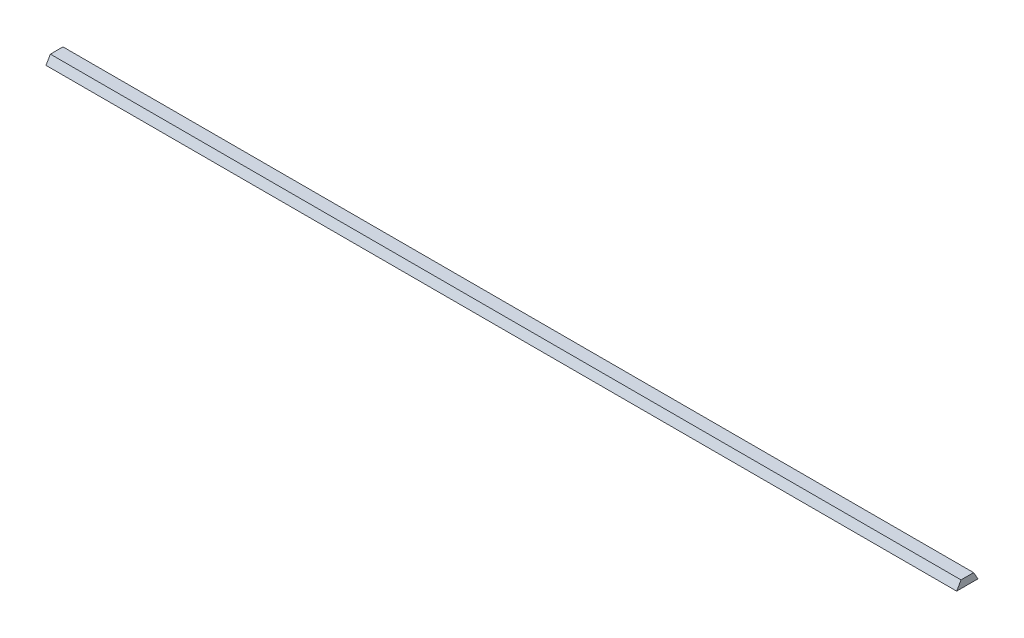
ISO-10303-21;
HEADER;
FILE_DESCRIPTION(('STEP AP214'),'2;1');
FILE_NAME('part.step','',(''),(''),'','','');
FILE_SCHEMA(('AUTOMOTIVE_DESIGN { 1 0 10303 214 1 1 1 1 }'));
ENDSEC;
DATA;
#1=APPLICATION_CONTEXT('core data for automotive mechanical design processes');
#2=APPLICATION_PROTOCOL_DEFINITION('international standard','automotive_design',2000,#1);
#3=PRODUCT_CONTEXT('',#1,'mechanical');
#4=PRODUCT('Part','Part','',(#3));
#5=PRODUCT_RELATED_PRODUCT_CATEGORY('part','',(#4));
#6=PRODUCT_DEFINITION_FORMATION('','',#4);
#7=PRODUCT_DEFINITION_CONTEXT('part definition',#1,'design');
#8=PRODUCT_DEFINITION('design','',#6,#7);
#9=PRODUCT_DEFINITION_SHAPE('','',#8);
#10=(LENGTH_UNIT() NAMED_UNIT(*) SI_UNIT(.MILLI.,.METRE.));
#11=(NAMED_UNIT(*) PLANE_ANGLE_UNIT() SI_UNIT($,.RADIAN.));
#12=(NAMED_UNIT(*) SI_UNIT($,.STERADIAN.) SOLID_ANGLE_UNIT());
#13=UNCERTAINTY_MEASURE_WITH_UNIT(LENGTH_MEASURE(1.E-05),#10,'distance_accuracy_value','');
#14=(GEOMETRIC_REPRESENTATION_CONTEXT(3) GLOBAL_UNCERTAINTY_ASSIGNED_CONTEXT((#13)) GLOBAL_UNIT_ASSIGNED_CONTEXT((#10,
#11,#12)) REPRESENTATION_CONTEXT('',''));
#15=CARTESIAN_POINT('',(0.,0.,0.));
#16=DIRECTION('',(0.,0.,1.));
#17=DIRECTION('',(1.,0.,0.));
#18=AXIS2_PLACEMENT_3D('',#15,#16,#17);
#19=CARTESIAN_POINT('',(2293.41358961173,0.,-26.8735226280625));
#20=DIRECTION('',(0.,-0.500000000000004,0.866025403784436));
#21=DIRECTION('',(0.,-0.866025403784436,-0.500000000000004));
#22=AXIS2_PLACEMENT_3D('',#19,#20,#21);
#23=PLANE('',#22);
#24=DIRECTION('',(0.,0.866025403784436,0.500000000000004));
#25=VECTOR('',#24,1.);
#26=CARTESIAN_POINT('',(0.,0.,-26.8735226280625));
#27=LINE('',#26,#25);
#28=CARTESIAN_POINT('',(0.,0.,-26.8735226280625));
#29=VERTEX_POINT('',#28);
#30=CARTESIAN_POINT('',(0.,19.05,-15.875));
#31=VERTEX_POINT('',#30);
#32=EDGE_CURVE('E98',#29,#31,#27,.T.);
#33=ORIENTED_EDGE('',*,*,#32,.T.);
#34=DIRECTION('',(-1.,0.,0.));
#35=VECTOR('',#34,1.);
#36=CARTESIAN_POINT('',(2293.41358961173,19.05,-15.875));
#37=LINE('',#36,#35);
#38=CARTESIAN_POINT('',(2293.41358961173,19.05,-15.875));
#39=VERTEX_POINT('',#38);
#40=EDGE_CURVE('E11',#39,#31,#37,.T.);
#41=ORIENTED_EDGE('',*,*,#40,.F.);
#42=DIRECTION('',(0.,0.866025403784436,0.500000000000004));
#43=VECTOR('',#42,1.);
#44=CARTESIAN_POINT('',(2293.41358961173,0.,-26.8735226280625));
#45=LINE('',#44,#43);
#46=CARTESIAN_POINT('',(2293.41358961173,0.,-26.8735226280625));
#47=VERTEX_POINT('',#46);
#48=EDGE_CURVE('E85',#47,#39,#45,.T.);
#49=ORIENTED_EDGE('',*,*,#48,.F.);
#50=DIRECTION('',(-1.,0.,0.));
#51=VECTOR('',#50,1.);
#52=CARTESIAN_POINT('',(2293.41358961173,0.,-26.8735226280625));
#53=LINE('',#52,#51);
#54=EDGE_CURVE('E94',#47,#29,#53,.T.);
#55=ORIENTED_EDGE('',*,*,#54,.T.);
#56=EDGE_LOOP('',(#33,#41,#49,#55));
#57=FACE_BOUND('',#56,.T.);
#58=ADVANCED_FACE('F34',(#57),#23,.F.);
#59=CARTESIAN_POINT('',(2293.41358961173,19.05,15.875));
#60=DIRECTION('',(0.,-1.,0.));
#61=DIRECTION('',(0.,0.,-1.));
#62=AXIS2_PLACEMENT_3D('',#59,#60,#61);
#63=PLANE('',#62);
#64=DIRECTION('',(0.,0.,1.));
#65=VECTOR('',#64,1.);
#66=CARTESIAN_POINT('',(0.,19.05,15.875));
#67=LINE('',#66,#65);
#68=CARTESIAN_POINT('',(0.,19.05,15.875));
#69=VERTEX_POINT('',#68);
#70=EDGE_CURVE('E89',#31,#69,#67,.T.);
#71=ORIENTED_EDGE('',*,*,#70,.T.);
#72=DIRECTION('',(-1.,0.,0.));
#73=VECTOR('',#72,1.);
#74=CARTESIAN_POINT('',(2293.41358961173,19.05,15.875));
#75=LINE('',#74,#73);
#76=CARTESIAN_POINT('',(2293.41358961173,19.05,15.875));
#77=VERTEX_POINT('',#76);
#78=EDGE_CURVE('E42',#77,#69,#75,.T.);
#79=ORIENTED_EDGE('',*,*,#78,.F.);
#80=DIRECTION('',(0.,0.,1.));
#81=VECTOR('',#80,1.);
#82=CARTESIAN_POINT('',(2293.41358961173,19.05,15.875));
#83=LINE('',#82,#81);
#84=EDGE_CURVE('E80',#39,#77,#83,.T.);
#85=ORIENTED_EDGE('',*,*,#84,.F.);
#86=ORIENTED_EDGE('',*,*,#40,.T.);
#87=EDGE_LOOP('',(#71,#79,#85,#86));
#88=FACE_BOUND('',#87,.T.);
#89=ADVANCED_FACE('F88',(#88),#63,.F.);
#90=CARTESIAN_POINT('',(2293.41358961173,0.,26.8735226280625));
#91=DIRECTION('',(0.,-0.500000000000004,-0.866025403784436));
#92=DIRECTION('',(0.,0.866025403784436,-0.500000000000004));
#93=AXIS2_PLACEMENT_3D('',#90,#91,#92);
#94=PLANE('',#93);
#95=DIRECTION('',(0.,-0.866025403784436,0.500000000000004));
#96=VECTOR('',#95,1.);
#97=CARTESIAN_POINT('',(0.,0.,26.8735226280625));
#98=LINE('',#97,#96);
#99=CARTESIAN_POINT('',(0.,0.,26.8735226280625));
#100=VERTEX_POINT('',#99);
#101=EDGE_CURVE('E67',#69,#100,#98,.T.);
#102=ORIENTED_EDGE('',*,*,#101,.T.);
#103=DIRECTION('',(-1.,0.,0.));
#104=VECTOR('',#103,1.);
#105=CARTESIAN_POINT('',(2293.41358961173,0.,26.8735226280625));
#106=LINE('',#105,#104);
#107=CARTESIAN_POINT('',(2293.41358961173,0.,26.8735226280625));
#108=VERTEX_POINT('',#107);
#109=EDGE_CURVE('E90',#108,#100,#106,.T.);
#110=ORIENTED_EDGE('',*,*,#109,.F.);
#111=DIRECTION('',(0.,-0.866025403784436,0.500000000000004));
#112=VECTOR('',#111,1.);
#113=CARTESIAN_POINT('',(2293.41358961173,0.,26.8735226280625));
#114=LINE('',#113,#112);
#115=EDGE_CURVE('E83',#77,#108,#114,.T.);
#116=ORIENTED_EDGE('',*,*,#115,.F.);
#117=ORIENTED_EDGE('',*,*,#78,.T.);
#118=EDGE_LOOP('',(#102,#110,#116,#117));
#119=FACE_BOUND('',#118,.T.);
#120=ADVANCED_FACE('F91',(#119),#94,.F.);
#121=CARTESIAN_POINT('',(2293.41358961173,0.,-26.8735226280625));
#122=DIRECTION('',(0.,1.,0.));
#123=DIRECTION('',(0.,0.,1.));
#124=AXIS2_PLACEMENT_3D('',#121,#122,#123);
#125=PLANE('',#124);
#126=DIRECTION('',(0.,0.,-1.));
#127=VECTOR('',#126,1.);
#128=CARTESIAN_POINT('',(0.,0.,-26.8735226280625));
#129=LINE('',#128,#127);
#130=EDGE_CURVE('E73',#100,#29,#129,.T.);
#131=ORIENTED_EDGE('',*,*,#130,.T.);
#132=ORIENTED_EDGE('',*,*,#54,.F.);
#133=DIRECTION('',(0.,0.,-1.));
#134=VECTOR('',#133,1.);
#135=CARTESIAN_POINT('',(2293.41358961173,0.,-26.8735226280625));
#136=LINE('',#135,#134);
#137=EDGE_CURVE('E50',#108,#47,#136,.T.);
#138=ORIENTED_EDGE('',*,*,#137,.F.);
#139=ORIENTED_EDGE('',*,*,#109,.T.);
#140=EDGE_LOOP('',(#131,#132,#138,#139));
#141=FACE_BOUND('',#140,.T.);
#142=ADVANCED_FACE('F106',(#141),#125,.F.);
#143=CARTESIAN_POINT('',(2293.41358961173,0.,0.));
#144=DIRECTION('',(-1.,0.,0.));
#145=DIRECTION('',(0.,0.,1.));
#146=AXIS2_PLACEMENT_3D('',#143,#144,#145);
#147=PLANE('',#146);
#148=ORIENTED_EDGE('',*,*,#48,.T.);
#149=ORIENTED_EDGE('',*,*,#84,.T.);
#150=ORIENTED_EDGE('',*,*,#115,.T.);
#151=ORIENTED_EDGE('',*,*,#137,.T.);
#152=EDGE_LOOP('',(#148,#149,#150,#151));
#153=FACE_BOUND('',#152,.T.);
#154=ADVANCED_FACE('F81',(#153),#147,.F.);
#155=CARTESIAN_POINT('',(0.,0.,0.));
#156=DIRECTION('',(-1.,0.,0.));
#157=DIRECTION('',(0.,0.,1.));
#158=AXIS2_PLACEMENT_3D('',#155,#156,#157);
#159=PLANE('',#158);
#160=ORIENTED_EDGE('',*,*,#32,.F.);
#161=ORIENTED_EDGE('',*,*,#130,.F.);
#162=ORIENTED_EDGE('',*,*,#101,.F.);
#163=ORIENTED_EDGE('',*,*,#70,.F.);
#164=EDGE_LOOP('',(#160,#161,#162,#163));
#165=FACE_BOUND('',#164,.T.);
#166=ADVANCED_FACE('F109',(#165),#159,.T.);
#167=CLOSED_SHELL('',(#58,#89,#120,#142,#154,#166));
#168=MANIFOLD_SOLID_BREP('B2',#167);
#169=ADVANCED_BREP_SHAPE_REPRESENTATION('',(#18,#168),#14);
#170=SHAPE_DEFINITION_REPRESENTATION(#9,#169);
ENDSEC;
END-ISO-10303-21;
